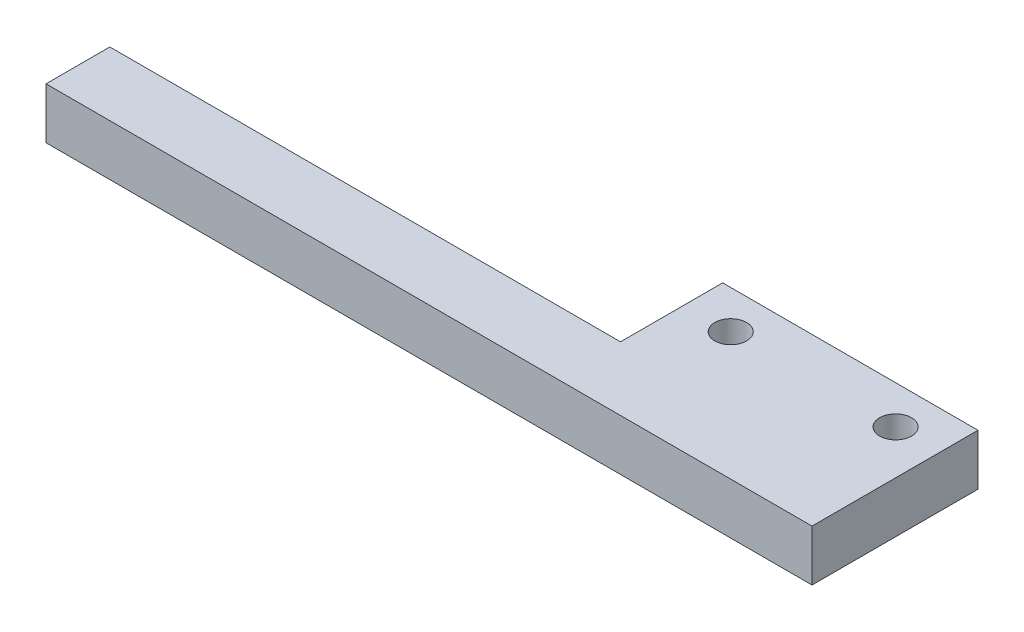
ISO-10303-21;
HEADER;
FILE_DESCRIPTION(('STEP AP214'),'2;1');
FILE_NAME('part.step','',(''),(''),'','','');
FILE_SCHEMA(('AUTOMOTIVE_DESIGN { 1 0 10303 214 1 1 1 1 }'));
ENDSEC;
DATA;
#1=APPLICATION_CONTEXT('core data for automotive mechanical design processes');
#2=APPLICATION_PROTOCOL_DEFINITION('international standard','automotive_design',2000,#1);
#3=PRODUCT_CONTEXT('',#1,'mechanical');
#4=PRODUCT('Part','Part','',(#3));
#5=PRODUCT_RELATED_PRODUCT_CATEGORY('part','',(#4));
#6=PRODUCT_DEFINITION_FORMATION('','',#4);
#7=PRODUCT_DEFINITION_CONTEXT('part definition',#1,'design');
#8=PRODUCT_DEFINITION('design','',#6,#7);
#9=PRODUCT_DEFINITION_SHAPE('','',#8);
#10=(LENGTH_UNIT() NAMED_UNIT(*) SI_UNIT(.MILLI.,.METRE.));
#11=(NAMED_UNIT(*) PLANE_ANGLE_UNIT() SI_UNIT($,.RADIAN.));
#12=(NAMED_UNIT(*) SI_UNIT($,.STERADIAN.) SOLID_ANGLE_UNIT());
#13=UNCERTAINTY_MEASURE_WITH_UNIT(LENGTH_MEASURE(1.E-05),#10,'distance_accuracy_value','');
#14=(GEOMETRIC_REPRESENTATION_CONTEXT(3) GLOBAL_UNCERTAINTY_ASSIGNED_CONTEXT((#13)) GLOBAL_UNIT_ASSIGNED_CONTEXT((#10,
#11,#12)) REPRESENTATION_CONTEXT('',''));
#15=CARTESIAN_POINT('',(0.,0.,0.));
#16=DIRECTION('',(0.,0.,1.));
#17=DIRECTION('',(1.,0.,0.));
#18=AXIS2_PLACEMENT_3D('',#15,#16,#17);
#19=CARTESIAN_POINT('',(-3.45531075464469,-3.5,3.));
#20=DIRECTION('',(0.,-1.,0.));
#21=DIRECTION('',(-1.,0.,0.));
#22=AXIS2_PLACEMENT_3D('',#19,#20,#21);
#23=CONICAL_SURFACE('',#22,0.999999998205103,0.7853981625);
#24=CARTESIAN_POINT('',(-3.45531075464469,-3.75,3.));
#25=DIRECTION('',(0.,-1.,0.));
#26=DIRECTION('',(0.,0.,-1.));
#27=AXIS2_PLACEMENT_3D('',#24,#25,#26);
#28=CIRCLE('',#27,1.25);
#29=CARTESIAN_POINT('',(-3.45531075464469,-3.75,1.75));
#30=VERTEX_POINT('',#29);
#31=EDGE_CURVE('E11',#30,#30,#28,.T.);
#32=ORIENTED_EDGE('',*,*,#31,.F.);
#33=EDGE_LOOP('',(#32));
#34=FACE_BOUND('',#33,.T.);
#35=CARTESIAN_POINT('',(-3.45531075464469,-4.,3.));
#36=DIRECTION('',(0.,-1.,0.));
#37=DIRECTION('',(0.,0.,-1.));
#38=AXIS2_PLACEMENT_3D('',#35,#36,#37);
#39=CIRCLE('',#38,1.5);
#40=CARTESIAN_POINT('',(-3.45531075464469,-4.,1.5));
#41=VERTEX_POINT('',#40);
#42=EDGE_CURVE('E167',#41,#41,#39,.T.);
#43=ORIENTED_EDGE('',*,*,#42,.T.);
#44=EDGE_LOOP('',(#43));
#45=FACE_BOUND('',#44,.T.);
#46=ADVANCED_FACE('F16',(#34,#45),#23,.F.);
#47=CARTESIAN_POINT('',(-3.45531075464469,-4.,3.));
#48=DIRECTION('',(0.,1.,0.));
#49=DIRECTION('',(0.,0.,1.));
#50=AXIS2_PLACEMENT_3D('',#47,#48,#49);
#51=CYLINDRICAL_SURFACE('',#50,1.25);
#52=CARTESIAN_POINT('',(-3.45531075464469,0.,3.));
#53=DIRECTION('',(0.,-1.,0.));
#54=DIRECTION('',(0.,0.,-1.));
#55=AXIS2_PLACEMENT_3D('',#52,#53,#54);
#56=CIRCLE('',#55,1.25);
#57=CARTESIAN_POINT('',(-3.45531075464469,0.,1.75));
#58=VERTEX_POINT('',#57);
#59=EDGE_CURVE('E175',#58,#58,#56,.T.);
#60=ORIENTED_EDGE('',*,*,#59,.F.);
#61=EDGE_LOOP('',(#60));
#62=FACE_BOUND('',#61,.T.);
#63=ORIENTED_EDGE('',*,*,#31,.T.);
#64=EDGE_LOOP('',(#63));
#65=FACE_BOUND('',#64,.T.);
#66=ADVANCED_FACE('F18',(#62,#65),#51,.F.);
#67=CARTESIAN_POINT('',(-16.3687330531771,-3.5,3.));
#68=DIRECTION('',(0.,-1.,0.));
#69=DIRECTION('',(-1.,0.,0.));
#70=AXIS2_PLACEMENT_3D('',#67,#68,#69);
#71=CONICAL_SURFACE('',#70,0.999999998205103,0.7853981625);
#72=CARTESIAN_POINT('',(-16.3687330531771,-3.75,3.));
#73=DIRECTION('',(0.,-1.,0.));
#74=DIRECTION('',(0.,0.,-1.));
#75=AXIS2_PLACEMENT_3D('',#72,#73,#74);
#76=CIRCLE('',#75,1.25);
#77=CARTESIAN_POINT('',(-16.3687330531771,-3.75,1.75));
#78=VERTEX_POINT('',#77);
#79=EDGE_CURVE('E25',#78,#78,#76,.T.);
#80=ORIENTED_EDGE('',*,*,#79,.F.);
#81=EDGE_LOOP('',(#80));
#82=FACE_BOUND('',#81,.T.);
#83=CARTESIAN_POINT('',(-16.3687330531771,-4.,3.));
#84=DIRECTION('',(0.,-1.,0.));
#85=DIRECTION('',(0.,0.,-1.));
#86=AXIS2_PLACEMENT_3D('',#83,#84,#85);
#87=CIRCLE('',#86,1.5);
#88=CARTESIAN_POINT('',(-16.3687330531771,-4.,1.5));
#89=VERTEX_POINT('',#88);
#90=EDGE_CURVE('E171',#89,#89,#87,.T.);
#91=ORIENTED_EDGE('',*,*,#90,.T.);
#92=EDGE_LOOP('',(#91));
#93=FACE_BOUND('',#92,.T.);
#94=ADVANCED_FACE('F189',(#82,#93),#71,.F.);
#95=CARTESIAN_POINT('',(-16.3687330531771,-4.,3.));
#96=DIRECTION('',(0.,1.,0.));
#97=DIRECTION('',(0.,0.,1.));
#98=AXIS2_PLACEMENT_3D('',#95,#96,#97);
#99=CYLINDRICAL_SURFACE('',#98,1.25);
#100=CARTESIAN_POINT('',(-16.3687330531771,0.,3.));
#101=DIRECTION('',(0.,-1.,0.));
#102=DIRECTION('',(0.,0.,-1.));
#103=AXIS2_PLACEMENT_3D('',#100,#101,#102);
#104=CIRCLE('',#103,1.25);
#105=CARTESIAN_POINT('',(-16.3687330531771,0.,1.75));
#106=VERTEX_POINT('',#105);
#107=EDGE_CURVE('E132',#106,#106,#104,.T.);
#108=ORIENTED_EDGE('',*,*,#107,.F.);
#109=EDGE_LOOP('',(#108));
#110=FACE_BOUND('',#109,.T.);
#111=ORIENTED_EDGE('',*,*,#79,.T.);
#112=EDGE_LOOP('',(#111));
#113=FACE_BOUND('',#112,.T.);
#114=ADVANCED_FACE('F186',(#110,#113),#99,.F.);
#115=CARTESIAN_POINT('',(0.,0.,0.));
#116=DIRECTION('',(0.,-1.,0.));
#117=DIRECTION('',(0.,0.,-1.));
#118=AXIS2_PLACEMENT_3D('',#115,#116,#117);
#119=PLANE('',#118);
#120=DIRECTION('',(0.,0.,-1.));
#121=VECTOR('',#120,1.);
#122=CARTESIAN_POINT('',(-60.,0.,13.));
#123=LINE('',#122,#121);
#124=CARTESIAN_POINT('',(-60.,0.,13.));
#125=VERTEX_POINT('',#124);
#126=CARTESIAN_POINT('',(-60.,0.,8.));
#127=VERTEX_POINT('',#126);
#128=EDGE_CURVE('E113',#125,#127,#123,.T.);
#129=ORIENTED_EDGE('',*,*,#128,.F.);
#130=DIRECTION('',(-1.,0.,0.));
#131=VECTOR('',#130,1.);
#132=CARTESIAN_POINT('',(0.,0.,13.));
#133=LINE('',#132,#131);
#134=CARTESIAN_POINT('',(0.,0.,13.));
#135=VERTEX_POINT('',#134);
#136=EDGE_CURVE('E47',#135,#125,#133,.T.);
#137=ORIENTED_EDGE('',*,*,#136,.F.);
#138=DIRECTION('',(0.,0.,1.));
#139=VECTOR('',#138,1.);
#140=CARTESIAN_POINT('',(0.,0.,8.));
#141=LINE('',#140,#139);
#142=CARTESIAN_POINT('',(0.,0.,0.));
#143=VERTEX_POINT('',#142);
#144=EDGE_CURVE('E123',#143,#135,#141,.T.);
#145=ORIENTED_EDGE('',*,*,#144,.F.);
#146=DIRECTION('',(1.,0.,0.));
#147=VECTOR('',#146,1.);
#148=CARTESIAN_POINT('',(-20.,0.,0.));
#149=LINE('',#148,#147);
#150=CARTESIAN_POINT('',(-20.,0.,0.));
#151=VERTEX_POINT('',#150);
#152=EDGE_CURVE('E141',#151,#143,#149,.T.);
#153=ORIENTED_EDGE('',*,*,#152,.F.);
#154=DIRECTION('',(0.,0.,-1.));
#155=VECTOR('',#154,1.);
#156=CARTESIAN_POINT('',(-20.,0.,8.));
#157=LINE('',#156,#155);
#158=CARTESIAN_POINT('',(-20.,0.,8.));
#159=VERTEX_POINT('',#158);
#160=EDGE_CURVE('E101',#159,#151,#157,.T.);
#161=ORIENTED_EDGE('',*,*,#160,.F.);
#162=DIRECTION('',(1.,0.,0.));
#163=VECTOR('',#162,1.);
#164=CARTESIAN_POINT('',(-60.,0.,8.));
#165=LINE('',#164,#163);
#166=EDGE_CURVE('E121',#127,#159,#165,.T.);
#167=ORIENTED_EDGE('',*,*,#166,.F.);
#168=EDGE_LOOP('',(#129,#137,#145,#153,#161,#167));
#169=FACE_BOUND('',#168,.T.);
#170=ORIENTED_EDGE('',*,*,#107,.T.);
#171=EDGE_LOOP('',(#170));
#172=FACE_BOUND('',#171,.T.);
#173=ORIENTED_EDGE('',*,*,#59,.T.);
#174=EDGE_LOOP('',(#173));
#175=FACE_BOUND('',#174,.T.);
#176=ADVANCED_FACE('F183',(#169,#172,#175),#119,.F.);
#177=CARTESIAN_POINT('',(0.,-4.,0.));
#178=DIRECTION('',(0.,-1.,0.));
#179=DIRECTION('',(0.,0.,-1.));
#180=AXIS2_PLACEMENT_3D('',#177,#178,#179);
#181=PLANE('',#180);
#182=DIRECTION('',(0.,0.,-1.));
#183=VECTOR('',#182,1.);
#184=CARTESIAN_POINT('',(-60.,-4.,13.));
#185=LINE('',#184,#183);
#186=CARTESIAN_POINT('',(-60.,-4.,13.));
#187=VERTEX_POINT('',#186);
#188=CARTESIAN_POINT('',(-60.,-4.,8.));
#189=VERTEX_POINT('',#188);
#190=EDGE_CURVE('E104',#187,#189,#185,.T.);
#191=ORIENTED_EDGE('',*,*,#190,.T.);
#192=DIRECTION('',(1.,0.,0.));
#193=VECTOR('',#192,1.);
#194=CARTESIAN_POINT('',(-60.,-4.,8.));
#195=LINE('',#194,#193);
#196=CARTESIAN_POINT('',(-20.,-4.,8.));
#197=VERTEX_POINT('',#196);
#198=EDGE_CURVE('E89',#189,#197,#195,.T.);
#199=ORIENTED_EDGE('',*,*,#198,.T.);
#200=DIRECTION('',(0.,0.,-1.));
#201=VECTOR('',#200,1.);
#202=CARTESIAN_POINT('',(-20.,-4.,8.));
#203=LINE('',#202,#201);
#204=CARTESIAN_POINT('',(-20.,-4.,0.));
#205=VERTEX_POINT('',#204);
#206=EDGE_CURVE('E149',#197,#205,#203,.T.);
#207=ORIENTED_EDGE('',*,*,#206,.T.);
#208=DIRECTION('',(1.,0.,0.));
#209=VECTOR('',#208,1.);
#210=CARTESIAN_POINT('',(-20.,-4.,0.));
#211=LINE('',#210,#209);
#212=CARTESIAN_POINT('',(0.,-4.,0.));
#213=VERTEX_POINT('',#212);
#214=EDGE_CURVE('E128',#205,#213,#211,.T.);
#215=ORIENTED_EDGE('',*,*,#214,.T.);
#216=DIRECTION('',(0.,0.,1.));
#217=VECTOR('',#216,1.);
#218=CARTESIAN_POINT('',(0.,-4.,0.));
#219=LINE('',#218,#217);
#220=CARTESIAN_POINT('',(0.,-4.,13.));
#221=VERTEX_POINT('',#220);
#222=EDGE_CURVE('E150',#213,#221,#219,.T.);
#223=ORIENTED_EDGE('',*,*,#222,.T.);
#224=DIRECTION('',(-1.,0.,0.));
#225=VECTOR('',#224,1.);
#226=CARTESIAN_POINT('',(0.,-4.,13.));
#227=LINE('',#226,#225);
#228=EDGE_CURVE('E37',#221,#187,#227,.T.);
#229=ORIENTED_EDGE('',*,*,#228,.T.);
#230=EDGE_LOOP('',(#191,#199,#207,#215,#223,#229));
#231=FACE_BOUND('',#230,.T.);
#232=ORIENTED_EDGE('',*,*,#90,.F.);
#233=EDGE_LOOP('',(#232));
#234=FACE_BOUND('',#233,.T.);
#235=ORIENTED_EDGE('',*,*,#42,.F.);
#236=EDGE_LOOP('',(#235));
#237=FACE_BOUND('',#236,.T.);
#238=ADVANCED_FACE('F105',(#231,#234,#237),#181,.T.);
#239=CARTESIAN_POINT('',(0.,-4.,13.));
#240=DIRECTION('',(0.,0.,-1.));
#241=DIRECTION('',(0.,-1.,0.));
#242=AXIS2_PLACEMENT_3D('',#239,#240,#241);
#243=PLANE('',#242);
#244=ORIENTED_EDGE('',*,*,#136,.T.);
#245=DIRECTION('',(0.,1.,0.));
#246=VECTOR('',#245,1.);
#247=CARTESIAN_POINT('',(-60.,-4.,13.));
#248=LINE('',#247,#246);
#249=EDGE_CURVE('E110',#187,#125,#248,.T.);
#250=ORIENTED_EDGE('',*,*,#249,.F.);
#251=ORIENTED_EDGE('',*,*,#228,.F.);
#252=DIRECTION('',(0.,1.,0.));
#253=VECTOR('',#252,1.);
#254=CARTESIAN_POINT('',(0.,-4.,13.));
#255=LINE('',#254,#253);
#256=EDGE_CURVE('E127',#221,#135,#255,.T.);
#257=ORIENTED_EDGE('',*,*,#256,.T.);
#258=EDGE_LOOP('',(#244,#250,#251,#257));
#259=FACE_BOUND('',#258,.T.);
#260=ADVANCED_FACE('F198',(#259),#243,.F.);
#261=CARTESIAN_POINT('',(0.,-4.,8.));
#262=DIRECTION('',(-1.,0.,0.));
#263=DIRECTION('',(0.,0.,1.));
#264=AXIS2_PLACEMENT_3D('',#261,#262,#263);
#265=PLANE('',#264);
#266=ORIENTED_EDGE('',*,*,#144,.T.);
#267=ORIENTED_EDGE('',*,*,#256,.F.);
#268=ORIENTED_EDGE('',*,*,#222,.F.);
#269=DIRECTION('',(0.,1.,0.));
#270=VECTOR('',#269,1.);
#271=CARTESIAN_POINT('',(0.,-4.,0.));
#272=LINE('',#271,#270);
#273=EDGE_CURVE('E137',#213,#143,#272,.T.);
#274=ORIENTED_EDGE('',*,*,#273,.T.);
#275=EDGE_LOOP('',(#266,#267,#268,#274));
#276=FACE_BOUND('',#275,.T.);
#277=ADVANCED_FACE('F214',(#276),#265,.F.);
#278=CARTESIAN_POINT('',(-20.,-4.,0.));
#279=DIRECTION('',(0.,0.,1.));
#280=DIRECTION('',(1.,0.,0.));
#281=AXIS2_PLACEMENT_3D('',#278,#279,#280);
#282=PLANE('',#281);
#283=ORIENTED_EDGE('',*,*,#152,.T.);
#284=ORIENTED_EDGE('',*,*,#273,.F.);
#285=ORIENTED_EDGE('',*,*,#214,.F.);
#286=DIRECTION('',(0.,1.,0.));
#287=VECTOR('',#286,1.);
#288=CARTESIAN_POINT('',(-20.,-4.,0.));
#289=LINE('',#288,#287);
#290=EDGE_CURVE('E145',#205,#151,#289,.T.);
#291=ORIENTED_EDGE('',*,*,#290,.T.);
#292=EDGE_LOOP('',(#283,#284,#285,#291));
#293=FACE_BOUND('',#292,.T.);
#294=ADVANCED_FACE('F217',(#293),#282,.F.);
#295=CARTESIAN_POINT('',(-20.,-4.,8.));
#296=DIRECTION('',(1.,0.,0.));
#297=DIRECTION('',(0.,1.,0.));
#298=AXIS2_PLACEMENT_3D('',#295,#296,#297);
#299=PLANE('',#298);
#300=ORIENTED_EDGE('',*,*,#160,.T.);
#301=ORIENTED_EDGE('',*,*,#290,.F.);
#302=ORIENTED_EDGE('',*,*,#206,.F.);
#303=DIRECTION('',(0.,1.,0.));
#304=VECTOR('',#303,1.);
#305=CARTESIAN_POINT('',(-20.,-4.,8.));
#306=LINE('',#305,#304);
#307=EDGE_CURVE('E97',#197,#159,#306,.T.);
#308=ORIENTED_EDGE('',*,*,#307,.T.);
#309=EDGE_LOOP('',(#300,#301,#302,#308));
#310=FACE_BOUND('',#309,.T.);
#311=ADVANCED_FACE('F220',(#310),#299,.F.);
#312=CARTESIAN_POINT('',(-60.,-4.,8.));
#313=DIRECTION('',(0.,0.,1.));
#314=DIRECTION('',(1.,0.,0.));
#315=AXIS2_PLACEMENT_3D('',#312,#313,#314);
#316=PLANE('',#315);
#317=ORIENTED_EDGE('',*,*,#166,.T.);
#318=ORIENTED_EDGE('',*,*,#307,.F.);
#319=ORIENTED_EDGE('',*,*,#198,.F.);
#320=DIRECTION('',(0.,1.,0.));
#321=VECTOR('',#320,1.);
#322=CARTESIAN_POINT('',(-60.,-4.,8.));
#323=LINE('',#322,#321);
#324=EDGE_CURVE('E94',#189,#127,#323,.T.);
#325=ORIENTED_EDGE('',*,*,#324,.T.);
#326=EDGE_LOOP('',(#317,#318,#319,#325));
#327=FACE_BOUND('',#326,.T.);
#328=ADVANCED_FACE('F92',(#327),#316,.F.);
#329=CARTESIAN_POINT('',(-60.,-4.,13.));
#330=DIRECTION('',(1.,0.,0.));
#331=DIRECTION('',(0.,1.,0.));
#332=AXIS2_PLACEMENT_3D('',#329,#330,#331);
#333=PLANE('',#332);
#334=ORIENTED_EDGE('',*,*,#128,.T.);
#335=ORIENTED_EDGE('',*,*,#324,.F.);
#336=ORIENTED_EDGE('',*,*,#190,.F.);
#337=ORIENTED_EDGE('',*,*,#249,.T.);
#338=EDGE_LOOP('',(#334,#335,#336,#337));
#339=FACE_BOUND('',#338,.T.);
#340=ADVANCED_FACE('F112',(#339),#333,.F.);
#341=CLOSED_SHELL('',(#46,#66,#94,#114,#176,#238,#260,#277,#294,#311,#328,#340));
#342=MANIFOLD_SOLID_BREP('B1',#341);
#343=ADVANCED_BREP_SHAPE_REPRESENTATION('',(#18,#342),#14);
#344=SHAPE_DEFINITION_REPRESENTATION(#9,#343);
ENDSEC;
END-ISO-10303-21;
